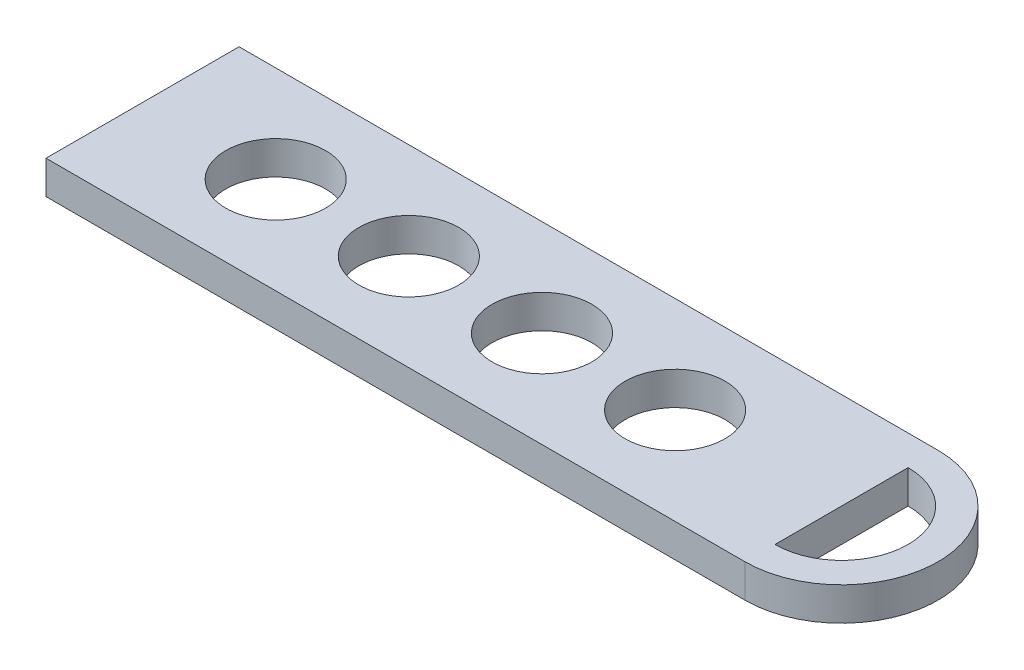
ISO-10303-21;
HEADER;
FILE_DESCRIPTION(('STEP AP214'),'2;1');
FILE_NAME('part.step','',(''),(''),'','','');
FILE_SCHEMA(('AUTOMOTIVE_DESIGN { 1 0 10303 214 1 1 1 1 }'));
ENDSEC;
DATA;
#1=APPLICATION_CONTEXT('core data for automotive mechanical design processes');
#2=APPLICATION_PROTOCOL_DEFINITION('international standard','automotive_design',2000,#1);
#3=PRODUCT_CONTEXT('',#1,'mechanical');
#4=PRODUCT('Part','Part','',(#3));
#5=PRODUCT_RELATED_PRODUCT_CATEGORY('part','',(#4));
#6=PRODUCT_DEFINITION_FORMATION('','',#4);
#7=PRODUCT_DEFINITION_CONTEXT('part definition',#1,'design');
#8=PRODUCT_DEFINITION('design','',#6,#7);
#9=PRODUCT_DEFINITION_SHAPE('','',#8);
#10=(LENGTH_UNIT() NAMED_UNIT(*) SI_UNIT(.MILLI.,.METRE.));
#11=(NAMED_UNIT(*) PLANE_ANGLE_UNIT() SI_UNIT($,.RADIAN.));
#12=(NAMED_UNIT(*) SI_UNIT($,.STERADIAN.) SOLID_ANGLE_UNIT());
#13=UNCERTAINTY_MEASURE_WITH_UNIT(LENGTH_MEASURE(1.E-05),#10,'distance_accuracy_value','');
#14=(GEOMETRIC_REPRESENTATION_CONTEXT(3) GLOBAL_UNCERTAINTY_ASSIGNED_CONTEXT((#13)) GLOBAL_UNIT_ASSIGNED_CONTEXT((#10,
#11,#12)) REPRESENTATION_CONTEXT('',''));
#15=CARTESIAN_POINT('',(0.,0.,0.));
#16=DIRECTION('',(0.,0.,1.));
#17=DIRECTION('',(1.,0.,0.));
#18=AXIS2_PLACEMENT_3D('',#15,#16,#17);
#19=CARTESIAN_POINT('',(105.,-2.5,-14.5));
#20=DIRECTION('',(0.,0.,1.));
#21=DIRECTION('',(1.,0.,0.));
#22=AXIS2_PLACEMENT_3D('',#19,#20,#21);
#23=PLANE('',#22);
#24=DIRECTION('',(0.,1.,0.));
#25=VECTOR('',#24,1.);
#26=CARTESIAN_POINT('',(0.,-2.5,-14.5));
#27=LINE('',#26,#25);
#28=CARTESIAN_POINT('',(0.,-2.5,-14.5));
#29=VERTEX_POINT('',#28);
#30=CARTESIAN_POINT('',(0.,2.5,-14.5));
#31=VERTEX_POINT('',#30);
#32=EDGE_CURVE('E132',#29,#31,#27,.T.);
#33=ORIENTED_EDGE('',*,*,#32,.T.);
#34=DIRECTION('',(-1.,0.,0.));
#35=VECTOR('',#34,1.);
#36=CARTESIAN_POINT('',(105.,2.5,-14.5));
#37=LINE('',#36,#35);
#38=CARTESIAN_POINT('',(105.,2.5,-14.5));
#39=VERTEX_POINT('',#38);
#40=EDGE_CURVE('E11',#39,#31,#37,.T.);
#41=ORIENTED_EDGE('',*,*,#40,.F.);
#42=DIRECTION('',(0.,1.,0.));
#43=VECTOR('',#42,1.);
#44=CARTESIAN_POINT('',(105.,-2.5,-14.5));
#45=LINE('',#44,#43);
#46=CARTESIAN_POINT('',(105.,-2.5,-14.5));
#47=VERTEX_POINT('',#46);
#48=EDGE_CURVE('E133',#47,#39,#45,.T.);
#49=ORIENTED_EDGE('',*,*,#48,.F.);
#50=DIRECTION('',(-1.,0.,0.));
#51=VECTOR('',#50,1.);
#52=CARTESIAN_POINT('',(105.,-2.5,-14.5));
#53=LINE('',#52,#51);
#54=EDGE_CURVE('E86',#47,#29,#53,.T.);
#55=ORIENTED_EDGE('',*,*,#54,.T.);
#56=EDGE_LOOP('',(#33,#41,#49,#55));
#57=FACE_BOUND('',#56,.T.);
#58=ADVANCED_FACE('F33',(#57),#23,.F.);
#59=CARTESIAN_POINT('',(105.,2.5,14.5));
#60=DIRECTION('',(0.,-1.,0.));
#61=DIRECTION('',(0.,0.,-1.));
#62=AXIS2_PLACEMENT_3D('',#59,#60,#61);
#63=PLANE('',#62);
#64=DIRECTION('',(0.,0.,1.));
#65=VECTOR('',#64,1.);
#66=CARTESIAN_POINT('',(105.,2.5,14.5));
#67=LINE('',#66,#65);
#68=CARTESIAN_POINT('',(105.,2.5,-9.99999999999999));
#69=VERTEX_POINT('',#68);
#70=CARTESIAN_POINT('',(105.,2.5,10.));
#71=VERTEX_POINT('',#70);
#72=EDGE_CURVE('E52',#69,#71,#67,.T.);
#73=ORIENTED_EDGE('',*,*,#72,.F.);
#74=CARTESIAN_POINT('',(105.,2.5,0.));
#75=DIRECTION('',(0.,1.,0.));
#76=DIRECTION('',(0.,0.,1.));
#77=AXIS2_PLACEMENT_3D('',#74,#75,#76);
#78=CIRCLE('',#77,10.);
#79=EDGE_CURVE('E95',#71,#69,#78,.T.);
#80=ORIENTED_EDGE('',*,*,#79,.F.);
#81=EDGE_LOOP('',(#73,#80));
#82=FACE_BOUND('',#81,.T.);
#83=CARTESIAN_POINT('',(20.,2.5,0.));
#84=DIRECTION('',(0.,-1.,0.));
#85=DIRECTION('',(0.,0.,-1.));
#86=AXIS2_PLACEMENT_3D('',#83,#84,#85);
#87=CIRCLE('',#86,7.5);
#88=CARTESIAN_POINT('',(20.,2.5,-7.5));
#89=VERTEX_POINT('',#88);
#90=EDGE_CURVE('E129',#89,#89,#87,.T.);
#91=ORIENTED_EDGE('',*,*,#90,.T.);
#92=EDGE_LOOP('',(#91));
#93=FACE_BOUND('',#92,.T.);
#94=CARTESIAN_POINT('',(40.,2.5,0.));
#95=DIRECTION('',(0.,-1.,0.));
#96=DIRECTION('',(0.,0.,-1.));
#97=AXIS2_PLACEMENT_3D('',#94,#95,#96);
#98=CIRCLE('',#97,7.5);
#99=CARTESIAN_POINT('',(40.,2.5,-7.5));
#100=VERTEX_POINT('',#99);
#101=EDGE_CURVE('E126',#100,#100,#98,.T.);
#102=ORIENTED_EDGE('',*,*,#101,.T.);
#103=EDGE_LOOP('',(#102));
#104=FACE_BOUND('',#103,.T.);
#105=CARTESIAN_POINT('',(60.,2.5,0.));
#106=DIRECTION('',(0.,-1.,0.));
#107=DIRECTION('',(0.,0.,-1.));
#108=AXIS2_PLACEMENT_3D('',#105,#106,#107);
#109=CIRCLE('',#108,7.50000000000001);
#110=CARTESIAN_POINT('',(60.,2.5,-7.50000000000001));
#111=VERTEX_POINT('',#110);
#112=EDGE_CURVE('E123',#111,#111,#109,.T.);
#113=ORIENTED_EDGE('',*,*,#112,.T.);
#114=EDGE_LOOP('',(#113));
#115=FACE_BOUND('',#114,.T.);
#116=CARTESIAN_POINT('',(80.,2.5,0.));
#117=DIRECTION('',(0.,-1.,0.));
#118=DIRECTION('',(0.,0.,-1.));
#119=AXIS2_PLACEMENT_3D('',#116,#117,#118);
#120=CIRCLE('',#119,7.50000000000001);
#121=CARTESIAN_POINT('',(80.,2.5,-7.50000000000001));
#122=VERTEX_POINT('',#121);
#123=EDGE_CURVE('E112',#122,#122,#120,.T.);
#124=ORIENTED_EDGE('',*,*,#123,.T.);
#125=EDGE_LOOP('',(#124));
#126=FACE_BOUND('',#125,.T.);
#127=DIRECTION('',(0.,0.,1.));
#128=VECTOR('',#127,1.);
#129=CARTESIAN_POINT('',(0.,2.5,14.5));
#130=LINE('',#129,#128);
#131=CARTESIAN_POINT('',(0.,2.5,14.5));
#132=VERTEX_POINT('',#131);
#133=EDGE_CURVE('E142',#31,#132,#130,.T.);
#134=ORIENTED_EDGE('',*,*,#133,.T.);
#135=DIRECTION('',(-1.,0.,0.));
#136=VECTOR('',#135,1.);
#137=CARTESIAN_POINT('',(105.,2.5,14.5));
#138=LINE('',#137,#136);
#139=CARTESIAN_POINT('',(105.,2.5,14.5));
#140=VERTEX_POINT('',#139);
#141=EDGE_CURVE('E40',#140,#132,#138,.T.);
#142=ORIENTED_EDGE('',*,*,#141,.F.);
#143=CARTESIAN_POINT('',(105.,2.5,0.));
#144=DIRECTION('',(0.,-1.,0.));
#145=DIRECTION('',(0.,0.,-1.));
#146=AXIS2_PLACEMENT_3D('',#143,#144,#145);
#147=CIRCLE('',#146,14.5);
#148=EDGE_CURVE('E98',#39,#140,#147,.T.);
#149=ORIENTED_EDGE('',*,*,#148,.F.);
#150=ORIENTED_EDGE('',*,*,#40,.T.);
#151=EDGE_LOOP('',(#134,#142,#149,#150));
#152=FACE_BOUND('',#151,.T.);
#153=ADVANCED_FACE('F169',(#82,#93,#104,#115,#126,#152),#63,.F.);
#154=CARTESIAN_POINT('',(105.,-2.5,14.5));
#155=DIRECTION('',(0.,0.,-1.));
#156=DIRECTION('',(-1.,0.,0.));
#157=AXIS2_PLACEMENT_3D('',#154,#155,#156);
#158=PLANE('',#157);
#159=DIRECTION('',(0.,-1.,0.));
#160=VECTOR('',#159,1.);
#161=CARTESIAN_POINT('',(0.,-2.5,14.5));
#162=LINE('',#161,#160);
#163=CARTESIAN_POINT('',(0.,-2.5,14.5));
#164=VERTEX_POINT('',#163);
#165=EDGE_CURVE('E144',#132,#164,#162,.T.);
#166=ORIENTED_EDGE('',*,*,#165,.T.);
#167=DIRECTION('',(-1.,0.,0.));
#168=VECTOR('',#167,1.);
#169=CARTESIAN_POINT('',(105.,-2.5,14.5));
#170=LINE('',#169,#168);
#171=CARTESIAN_POINT('',(105.,-2.5,14.5));
#172=VERTEX_POINT('',#171);
#173=EDGE_CURVE('E149',#172,#164,#170,.T.);
#174=ORIENTED_EDGE('',*,*,#173,.F.);
#175=DIRECTION('',(0.,-1.,0.));
#176=VECTOR('',#175,1.);
#177=CARTESIAN_POINT('',(105.,-2.5,14.5));
#178=LINE('',#177,#176);
#179=EDGE_CURVE('E87',#140,#172,#178,.T.);
#180=ORIENTED_EDGE('',*,*,#179,.F.);
#181=ORIENTED_EDGE('',*,*,#141,.T.);
#182=EDGE_LOOP('',(#166,#174,#180,#181));
#183=FACE_BOUND('',#182,.T.);
#184=ADVANCED_FACE('F155',(#183),#158,.F.);
#185=CARTESIAN_POINT('',(105.,-2.5,14.5));
#186=DIRECTION('',(0.,1.,0.));
#187=DIRECTION('',(0.,0.,1.));
#188=AXIS2_PLACEMENT_3D('',#185,#186,#187);
#189=PLANE('',#188);
#190=ORIENTED_EDGE('',*,*,#54,.F.);
#191=CARTESIAN_POINT('',(105.,-2.5,0.));
#192=DIRECTION('',(0.,-1.,0.));
#193=DIRECTION('',(0.,0.,-1.));
#194=AXIS2_PLACEMENT_3D('',#191,#192,#193);
#195=CIRCLE('',#194,14.5);
#196=EDGE_CURVE('E99',#47,#172,#195,.T.);
#197=ORIENTED_EDGE('',*,*,#196,.T.);
#198=ORIENTED_EDGE('',*,*,#173,.T.);
#199=DIRECTION('',(0.,0.,-1.));
#200=VECTOR('',#199,1.);
#201=CARTESIAN_POINT('',(0.,-2.5,14.5));
#202=LINE('',#201,#200);
#203=EDGE_CURVE('E136',#164,#29,#202,.T.);
#204=ORIENTED_EDGE('',*,*,#203,.T.);
#205=EDGE_LOOP('',(#190,#197,#198,#204));
#206=FACE_BOUND('',#205,.T.);
#207=CARTESIAN_POINT('',(20.,-2.5,0.));
#208=DIRECTION('',(0.,-1.,0.));
#209=DIRECTION('',(0.,0.,-1.));
#210=AXIS2_PLACEMENT_3D('',#207,#208,#209);
#211=CIRCLE('',#210,7.5);
#212=CARTESIAN_POINT('',(20.,-2.5,-7.5));
#213=VERTEX_POINT('',#212);
#214=EDGE_CURVE('E109',#213,#213,#211,.T.);
#215=ORIENTED_EDGE('',*,*,#214,.F.);
#216=EDGE_LOOP('',(#215));
#217=FACE_BOUND('',#216,.T.);
#218=CARTESIAN_POINT('',(40.,-2.5,0.));
#219=DIRECTION('',(0.,-1.,0.));
#220=DIRECTION('',(0.,0.,-1.));
#221=AXIS2_PLACEMENT_3D('',#218,#219,#220);
#222=CIRCLE('',#221,7.5);
#223=CARTESIAN_POINT('',(40.,-2.5,-7.5));
#224=VERTEX_POINT('',#223);
#225=EDGE_CURVE('E113',#224,#224,#222,.T.);
#226=ORIENTED_EDGE('',*,*,#225,.F.);
#227=EDGE_LOOP('',(#226));
#228=FACE_BOUND('',#227,.T.);
#229=CARTESIAN_POINT('',(60.,-2.5,0.));
#230=DIRECTION('',(0.,-1.,0.));
#231=DIRECTION('',(0.,0.,-1.));
#232=AXIS2_PLACEMENT_3D('',#229,#230,#231);
#233=CIRCLE('',#232,7.50000000000001);
#234=CARTESIAN_POINT('',(60.,-2.5,-7.50000000000001));
#235=VERTEX_POINT('',#234);
#236=EDGE_CURVE('E116',#235,#235,#233,.T.);
#237=ORIENTED_EDGE('',*,*,#236,.F.);
#238=EDGE_LOOP('',(#237));
#239=FACE_BOUND('',#238,.T.);
#240=CARTESIAN_POINT('',(80.,-2.5,0.));
#241=DIRECTION('',(0.,-1.,0.));
#242=DIRECTION('',(0.,0.,-1.));
#243=AXIS2_PLACEMENT_3D('',#240,#241,#242);
#244=CIRCLE('',#243,7.50000000000001);
#245=CARTESIAN_POINT('',(80.,-2.5,-7.50000000000001));
#246=VERTEX_POINT('',#245);
#247=EDGE_CURVE('E107',#246,#246,#244,.T.);
#248=ORIENTED_EDGE('',*,*,#247,.F.);
#249=EDGE_LOOP('',(#248));
#250=FACE_BOUND('',#249,.T.);
#251=CARTESIAN_POINT('',(105.,-2.5,0.));
#252=DIRECTION('',(0.,1.,0.));
#253=DIRECTION('',(0.,0.,1.));
#254=AXIS2_PLACEMENT_3D('',#251,#252,#253);
#255=CIRCLE('',#254,10.);
#256=CARTESIAN_POINT('',(105.,-2.5,10.));
#257=VERTEX_POINT('',#256);
#258=CARTESIAN_POINT('',(105.,-2.5,-9.99999999999999));
#259=VERTEX_POINT('',#258);
#260=EDGE_CURVE('E85',#257,#259,#255,.T.);
#261=ORIENTED_EDGE('',*,*,#260,.T.);
#262=DIRECTION('',(0.,0.,-1.));
#263=VECTOR('',#262,1.);
#264=CARTESIAN_POINT('',(105.,-2.5,14.5));
#265=LINE('',#264,#263);
#266=EDGE_CURVE('E47',#257,#259,#265,.T.);
#267=ORIENTED_EDGE('',*,*,#266,.F.);
#268=EDGE_LOOP('',(#261,#267));
#269=FACE_BOUND('',#268,.T.);
#270=ADVANCED_FACE('F83',(#206,#217,#228,#239,#250,#269),#189,.F.);
#271=CARTESIAN_POINT('',(105.,0.,0.));
#272=DIRECTION('',(-1.,0.,0.));
#273=DIRECTION('',(0.,0.,1.));
#274=AXIS2_PLACEMENT_3D('',#271,#272,#273);
#275=PLANE('',#274);
#276=ORIENTED_EDGE('',*,*,#266,.T.);
#277=DIRECTION('',(0.,-1.,0.));
#278=VECTOR('',#277,1.);
#279=CARTESIAN_POINT('',(105.,2.5,-10.));
#280=LINE('',#279,#278);
#281=EDGE_CURVE('E94',#69,#259,#280,.T.);
#282=ORIENTED_EDGE('',*,*,#281,.F.);
#283=ORIENTED_EDGE('',*,*,#72,.T.);
#284=DIRECTION('',(0.,-1.,0.));
#285=VECTOR('',#284,1.);
#286=CARTESIAN_POINT('',(105.,2.5,10.));
#287=LINE('',#286,#285);
#288=EDGE_CURVE('E89',#71,#257,#287,.T.);
#289=ORIENTED_EDGE('',*,*,#288,.T.);
#290=EDGE_LOOP('',(#276,#282,#283,#289));
#291=FACE_BOUND('',#290,.T.);
#292=ADVANCED_FACE('F90',(#291),#275,.F.);
#293=CARTESIAN_POINT('',(0.,0.,0.));
#294=DIRECTION('',(-1.,0.,0.));
#295=DIRECTION('',(0.,0.,1.));
#296=AXIS2_PLACEMENT_3D('',#293,#294,#295);
#297=PLANE('',#296);
#298=ORIENTED_EDGE('',*,*,#32,.F.);
#299=ORIENTED_EDGE('',*,*,#203,.F.);
#300=ORIENTED_EDGE('',*,*,#165,.F.);
#301=ORIENTED_EDGE('',*,*,#133,.F.);
#302=EDGE_LOOP('',(#298,#299,#300,#301));
#303=FACE_BOUND('',#302,.T.);
#304=ADVANCED_FACE('F161',(#303),#297,.T.);
#305=CARTESIAN_POINT('',(80.,102.5,0.));
#306=DIRECTION('',(0.,-1.,0.));
#307=DIRECTION('',(0.,0.,-1.));
#308=AXIS2_PLACEMENT_3D('',#305,#306,#307);
#309=CYLINDRICAL_SURFACE('',#308,7.50000000000001);
#310=ORIENTED_EDGE('',*,*,#247,.T.);
#311=EDGE_LOOP('',(#310));
#312=FACE_BOUND('',#311,.T.);
#313=ORIENTED_EDGE('',*,*,#123,.F.);
#314=EDGE_LOOP('',(#313));
#315=FACE_BOUND('',#314,.T.);
#316=ADVANCED_FACE('F183',(#312,#315),#309,.F.);
#317=CARTESIAN_POINT('',(60.,102.5,0.));
#318=DIRECTION('',(0.,-1.,0.));
#319=DIRECTION('',(0.,0.,-1.));
#320=AXIS2_PLACEMENT_3D('',#317,#318,#319);
#321=CYLINDRICAL_SURFACE('',#320,7.50000000000001);
#322=ORIENTED_EDGE('',*,*,#236,.T.);
#323=EDGE_LOOP('',(#322));
#324=FACE_BOUND('',#323,.T.);
#325=ORIENTED_EDGE('',*,*,#112,.F.);
#326=EDGE_LOOP('',(#325));
#327=FACE_BOUND('',#326,.T.);
#328=ADVANCED_FACE('F188',(#324,#327),#321,.F.);
#329=CARTESIAN_POINT('',(40.,102.5,0.));
#330=DIRECTION('',(0.,-1.,0.));
#331=DIRECTION('',(0.,0.,-1.));
#332=AXIS2_PLACEMENT_3D('',#329,#330,#331);
#333=CYLINDRICAL_SURFACE('',#332,7.5);
#334=ORIENTED_EDGE('',*,*,#225,.T.);
#335=EDGE_LOOP('',(#334));
#336=FACE_BOUND('',#335,.T.);
#337=ORIENTED_EDGE('',*,*,#101,.F.);
#338=EDGE_LOOP('',(#337));
#339=FACE_BOUND('',#338,.T.);
#340=ADVANCED_FACE('F192',(#336,#339),#333,.F.);
#341=CARTESIAN_POINT('',(20.,102.5,0.));
#342=DIRECTION('',(0.,-1.,0.));
#343=DIRECTION('',(0.,0.,-1.));
#344=AXIS2_PLACEMENT_3D('',#341,#342,#343);
#345=CYLINDRICAL_SURFACE('',#344,7.5);
#346=ORIENTED_EDGE('',*,*,#214,.T.);
#347=EDGE_LOOP('',(#346));
#348=FACE_BOUND('',#347,.T.);
#349=ORIENTED_EDGE('',*,*,#90,.F.);
#350=EDGE_LOOP('',(#349));
#351=FACE_BOUND('',#350,.T.);
#352=ADVANCED_FACE('F196',(#348,#351),#345,.F.);
#353=CARTESIAN_POINT('',(105.,2.5,0.));
#354=DIRECTION('',(0.,-1.,0.));
#355=DIRECTION('',(0.,0.,-1.));
#356=AXIS2_PLACEMENT_3D('',#353,#354,#355);
#357=CYLINDRICAL_SURFACE('',#356,14.5);
#358=ORIENTED_EDGE('',*,*,#196,.F.);
#359=ORIENTED_EDGE('',*,*,#48,.T.);
#360=ORIENTED_EDGE('',*,*,#148,.T.);
#361=ORIENTED_EDGE('',*,*,#179,.T.);
#362=EDGE_LOOP('',(#358,#359,#360,#361));
#363=FACE_BOUND('',#362,.T.);
#364=ADVANCED_FACE('F168',(#363),#357,.T.);
#365=CARTESIAN_POINT('',(105.,2.5,0.));
#366=DIRECTION('',(0.,-1.,0.));
#367=DIRECTION('',(0.,0.,-1.));
#368=AXIS2_PLACEMENT_3D('',#365,#366,#367);
#369=CYLINDRICAL_SURFACE('',#368,10.);
#370=ORIENTED_EDGE('',*,*,#260,.F.);
#371=ORIENTED_EDGE('',*,*,#288,.F.);
#372=ORIENTED_EDGE('',*,*,#79,.T.);
#373=ORIENTED_EDGE('',*,*,#281,.T.);
#374=EDGE_LOOP('',(#370,#371,#372,#373));
#375=FACE_BOUND('',#374,.T.);
#376=ADVANCED_FACE('F97',(#375),#369,.F.);
#377=CLOSED_SHELL('',(#58,#153,#184,#270,#292,#304,#316,#328,#340,#352,#364,#376));
#378=MANIFOLD_SOLID_BREP('B2',#377);
#379=ADVANCED_BREP_SHAPE_REPRESENTATION('',(#18,#378),#14);
#380=SHAPE_DEFINITION_REPRESENTATION(#9,#379);
ENDSEC;
END-ISO-10303-21;
